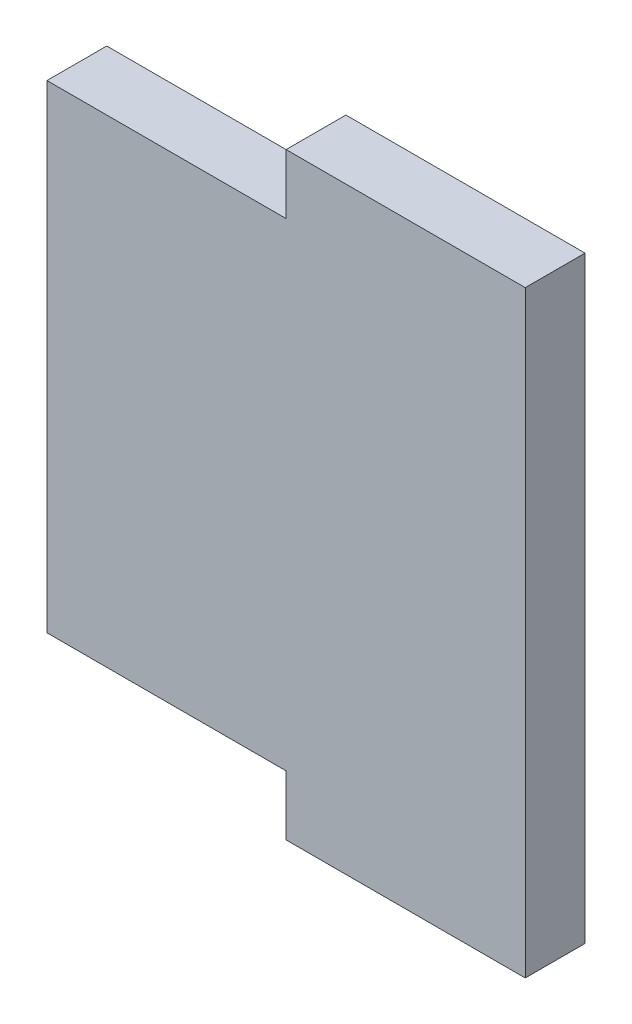
ISO-10303-21;
HEADER;
FILE_DESCRIPTION(('STEP AP214'),'2;1');
FILE_NAME('part.step','',(''),(''),'','','');
FILE_SCHEMA(('AUTOMOTIVE_DESIGN { 1 0 10303 214 1 1 1 1 }'));
ENDSEC;
DATA;
#1=APPLICATION_CONTEXT('core data for automotive mechanical design processes');
#2=APPLICATION_PROTOCOL_DEFINITION('international standard','automotive_design',2000,#1);
#3=PRODUCT_CONTEXT('',#1,'mechanical');
#4=PRODUCT('Part','Part','',(#3));
#5=PRODUCT_RELATED_PRODUCT_CATEGORY('part','',(#4));
#6=PRODUCT_DEFINITION_FORMATION('','',#4);
#7=PRODUCT_DEFINITION_CONTEXT('part definition',#1,'design');
#8=PRODUCT_DEFINITION('design','',#6,#7);
#9=PRODUCT_DEFINITION_SHAPE('','',#8);
#10=(LENGTH_UNIT() NAMED_UNIT(*) SI_UNIT(.MILLI.,.METRE.));
#11=(NAMED_UNIT(*) PLANE_ANGLE_UNIT() SI_UNIT($,.RADIAN.));
#12=(NAMED_UNIT(*) SI_UNIT($,.STERADIAN.) SOLID_ANGLE_UNIT());
#13=UNCERTAINTY_MEASURE_WITH_UNIT(LENGTH_MEASURE(1.E-05),#10,'distance_accuracy_value','');
#14=(GEOMETRIC_REPRESENTATION_CONTEXT(3) GLOBAL_UNCERTAINTY_ASSIGNED_CONTEXT((#13)) GLOBAL_UNIT_ASSIGNED_CONTEXT((#10,
#11,#12)) REPRESENTATION_CONTEXT('',''));
#15=CARTESIAN_POINT('',(0.,0.,0.));
#16=DIRECTION('',(0.,0.,1.));
#17=DIRECTION('',(1.,0.,0.));
#18=AXIS2_PLACEMENT_3D('',#15,#16,#17);
#19=CARTESIAN_POINT('',(212.725,0.,3.175));
#20=DIRECTION('',(0.,-1.,0.));
#21=DIRECTION('',(0.,0.,-1.));
#22=AXIS2_PLACEMENT_3D('',#19,#20,#21);
#23=PLANE('',#22);
#24=DIRECTION('',(-1.,0.,0.));
#25=VECTOR('',#24,1.);
#26=CARTESIAN_POINT('',(212.725,0.,0.));
#27=LINE('',#26,#25);
#28=CARTESIAN_POINT('',(212.725,0.,0.));
#29=VERTEX_POINT('',#28);
#30=CARTESIAN_POINT('',(200.025,0.,0.));
#31=VERTEX_POINT('',#30);
#32=EDGE_CURVE('E129',#29,#31,#27,.T.);
#33=ORIENTED_EDGE('',*,*,#32,.T.);
#34=DIRECTION('',(0.,0.,-1.));
#35=VECTOR('',#34,1.);
#36=CARTESIAN_POINT('',(200.025,0.,3.175));
#37=LINE('',#36,#35);
#38=CARTESIAN_POINT('',(200.025,0.,3.175));
#39=VERTEX_POINT('',#38);
#40=EDGE_CURVE('E11',#39,#31,#37,.T.);
#41=ORIENTED_EDGE('',*,*,#40,.F.);
#42=DIRECTION('',(-1.,0.,0.));
#43=VECTOR('',#42,1.);
#44=CARTESIAN_POINT('',(212.725,0.,3.175));
#45=LINE('',#44,#43);
#46=CARTESIAN_POINT('',(212.725,0.,3.175));
#47=VERTEX_POINT('',#46);
#48=EDGE_CURVE('E148',#47,#39,#45,.T.);
#49=ORIENTED_EDGE('',*,*,#48,.F.);
#50=DIRECTION('',(0.,0.,-1.));
#51=VECTOR('',#50,1.);
#52=CARTESIAN_POINT('',(212.725,0.,3.175));
#53=LINE('',#52,#51);
#54=EDGE_CURVE('E49',#47,#29,#53,.T.);
#55=ORIENTED_EDGE('',*,*,#54,.T.);
#56=EDGE_LOOP('',(#33,#41,#49,#55));
#57=FACE_BOUND('',#56,.T.);
#58=ADVANCED_FACE('F33',(#57),#23,.F.);
#59=CARTESIAN_POINT('',(200.025,0.,3.175));
#60=DIRECTION('',(1.,0.,0.));
#61=DIRECTION('',(0.,0.,-1.));
#62=AXIS2_PLACEMENT_3D('',#59,#60,#61);
#63=PLANE('',#62);
#64=DIRECTION('',(0.,-1.,0.));
#65=VECTOR('',#64,1.);
#66=CARTESIAN_POINT('',(200.025,0.,0.));
#67=LINE('',#66,#65);
#68=CARTESIAN_POINT('',(200.025,-3.175,0.));
#69=VERTEX_POINT('',#68);
#70=EDGE_CURVE('E131',#31,#69,#67,.T.);
#71=ORIENTED_EDGE('',*,*,#70,.T.);
#72=DIRECTION('',(0.,0.,-1.));
#73=VECTOR('',#72,1.);
#74=CARTESIAN_POINT('',(200.025,-3.175,3.175));
#75=LINE('',#74,#73);
#76=CARTESIAN_POINT('',(200.025,-3.175,3.175));
#77=VERTEX_POINT('',#76);
#78=EDGE_CURVE('E41',#77,#69,#75,.T.);
#79=ORIENTED_EDGE('',*,*,#78,.F.);
#80=DIRECTION('',(0.,-1.,0.));
#81=VECTOR('',#80,1.);
#82=CARTESIAN_POINT('',(200.025,0.,3.175));
#83=LINE('',#82,#81);
#84=EDGE_CURVE('E87',#39,#77,#83,.T.);
#85=ORIENTED_EDGE('',*,*,#84,.F.);
#86=ORIENTED_EDGE('',*,*,#40,.T.);
#87=EDGE_LOOP('',(#71,#79,#85,#86));
#88=FACE_BOUND('',#87,.T.);
#89=ADVANCED_FACE('F162',(#88),#63,.F.);
#90=CARTESIAN_POINT('',(187.325,-3.175,3.175));
#91=DIRECTION('',(0.,1.,0.));
#92=DIRECTION('',(0.,0.,1.));
#93=AXIS2_PLACEMENT_3D('',#90,#91,#92);
#94=PLANE('',#93);
#95=DIRECTION('',(1.,0.,0.));
#96=VECTOR('',#95,1.);
#97=CARTESIAN_POINT('',(187.325,-3.175,0.));
#98=LINE('',#97,#96);
#99=CARTESIAN_POINT('',(187.325,-3.175,0.));
#100=VERTEX_POINT('',#99);
#101=EDGE_CURVE('E134',#100,#69,#98,.T.);
#102=ORIENTED_EDGE('',*,*,#101,.F.);
#103=DIRECTION('',(0.,0.,-1.));
#104=VECTOR('',#103,1.);
#105=CARTESIAN_POINT('',(187.325,-3.175,3.175));
#106=LINE('',#105,#104);
#107=CARTESIAN_POINT('',(187.325,-3.175,3.175));
#108=VERTEX_POINT('',#107);
#109=EDGE_CURVE('E155',#108,#100,#106,.T.);
#110=ORIENTED_EDGE('',*,*,#109,.F.);
#111=DIRECTION('',(1.,0.,0.));
#112=VECTOR('',#111,1.);
#113=CARTESIAN_POINT('',(187.325,-3.175,3.175));
#114=LINE('',#113,#112);
#115=EDGE_CURVE('E161',#108,#77,#114,.T.);
#116=ORIENTED_EDGE('',*,*,#115,.T.);
#117=ORIENTED_EDGE('',*,*,#78,.T.);
#118=EDGE_LOOP('',(#102,#110,#116,#117));
#119=FACE_BOUND('',#118,.T.);
#120=ADVANCED_FACE('F159',(#119),#94,.T.);
#121=CARTESIAN_POINT('',(187.325,-3.175,3.175));
#122=DIRECTION('',(1.,0.,0.));
#123=DIRECTION('',(0.,0.,-1.));
#124=AXIS2_PLACEMENT_3D('',#121,#122,#123);
#125=PLANE('',#124);
#126=DIRECTION('',(0.,-1.,0.));
#127=VECTOR('',#126,1.);
#128=CARTESIAN_POINT('',(187.325,-3.175,0.));
#129=LINE('',#128,#127);
#130=CARTESIAN_POINT('',(187.325,-28.575,0.));
#131=VERTEX_POINT('',#130);
#132=EDGE_CURVE('E137',#100,#131,#129,.T.);
#133=ORIENTED_EDGE('',*,*,#132,.T.);
#134=DIRECTION('',(0.,0.,-1.));
#135=VECTOR('',#134,1.);
#136=CARTESIAN_POINT('',(187.325,-28.575,3.175));
#137=LINE('',#136,#135);
#138=CARTESIAN_POINT('',(187.325,-28.575,3.175));
#139=VERTEX_POINT('',#138);
#140=EDGE_CURVE('E152',#139,#131,#137,.T.);
#141=ORIENTED_EDGE('',*,*,#140,.F.);
#142=DIRECTION('',(0.,-1.,0.));
#143=VECTOR('',#142,1.);
#144=CARTESIAN_POINT('',(187.325,-3.175,3.175));
#145=LINE('',#144,#143);
#146=EDGE_CURVE('E174',#108,#139,#145,.T.);
#147=ORIENTED_EDGE('',*,*,#146,.F.);
#148=ORIENTED_EDGE('',*,*,#109,.T.);
#149=EDGE_LOOP('',(#133,#141,#147,#148));
#150=FACE_BOUND('',#149,.T.);
#151=ADVANCED_FACE('F170',(#150),#125,.F.);
#152=CARTESIAN_POINT('',(187.325,-28.575,3.175));
#153=DIRECTION('',(0.,1.,0.));
#154=DIRECTION('',(0.,0.,1.));
#155=AXIS2_PLACEMENT_3D('',#152,#153,#154);
#156=PLANE('',#155);
#157=DIRECTION('',(1.,0.,0.));
#158=VECTOR('',#157,1.);
#159=CARTESIAN_POINT('',(187.325,-28.575,0.));
#160=LINE('',#159,#158);
#161=CARTESIAN_POINT('',(200.025,-28.575,0.));
#162=VERTEX_POINT('',#161);
#163=EDGE_CURVE('E139',#131,#162,#160,.T.);
#164=ORIENTED_EDGE('',*,*,#163,.T.);
#165=DIRECTION('',(0.,0.,-1.));
#166=VECTOR('',#165,1.);
#167=CARTESIAN_POINT('',(200.025,-28.575,3.175));
#168=LINE('',#167,#166);
#169=CARTESIAN_POINT('',(200.025,-28.575,3.175));
#170=VERTEX_POINT('',#169);
#171=EDGE_CURVE('E112',#170,#162,#168,.T.);
#172=ORIENTED_EDGE('',*,*,#171,.F.);
#173=DIRECTION('',(1.,0.,0.));
#174=VECTOR('',#173,1.);
#175=CARTESIAN_POINT('',(187.325,-28.575,3.175));
#176=LINE('',#175,#174);
#177=EDGE_CURVE('E120',#139,#170,#176,.T.);
#178=ORIENTED_EDGE('',*,*,#177,.F.);
#179=ORIENTED_EDGE('',*,*,#140,.T.);
#180=EDGE_LOOP('',(#164,#172,#178,#179));
#181=FACE_BOUND('',#180,.T.);
#182=ADVANCED_FACE('F173',(#181),#156,.F.);
#183=CARTESIAN_POINT('',(200.025,-31.75,3.175));
#184=DIRECTION('',(-1.,0.,0.));
#185=DIRECTION('',(0.,0.,1.));
#186=AXIS2_PLACEMENT_3D('',#183,#184,#185);
#187=PLANE('',#186);
#188=DIRECTION('',(0.,1.,0.));
#189=VECTOR('',#188,1.);
#190=CARTESIAN_POINT('',(200.025,-31.75,0.));
#191=LINE('',#190,#189);
#192=CARTESIAN_POINT('',(200.025,-31.75,0.));
#193=VERTEX_POINT('',#192);
#194=EDGE_CURVE('E108',#193,#162,#191,.T.);
#195=ORIENTED_EDGE('',*,*,#194,.F.);
#196=DIRECTION('',(0.,0.,-1.));
#197=VECTOR('',#196,1.);
#198=CARTESIAN_POINT('',(200.025,-31.75,3.175));
#199=LINE('',#198,#197);
#200=CARTESIAN_POINT('',(200.025,-31.75,3.175));
#201=VERTEX_POINT('',#200);
#202=EDGE_CURVE('E103',#201,#193,#199,.T.);
#203=ORIENTED_EDGE('',*,*,#202,.F.);
#204=DIRECTION('',(0.,1.,0.));
#205=VECTOR('',#204,1.);
#206=CARTESIAN_POINT('',(200.025,-31.75,3.175));
#207=LINE('',#206,#205);
#208=EDGE_CURVE('E106',#201,#170,#207,.T.);
#209=ORIENTED_EDGE('',*,*,#208,.T.);
#210=ORIENTED_EDGE('',*,*,#171,.T.);
#211=EDGE_LOOP('',(#195,#203,#209,#210));
#212=FACE_BOUND('',#211,.T.);
#213=ADVANCED_FACE('F105',(#212),#187,.T.);
#214=CARTESIAN_POINT('',(212.725,-31.75,3.175));
#215=DIRECTION('',(0.,-1.,0.));
#216=DIRECTION('',(0.,0.,-1.));
#217=AXIS2_PLACEMENT_3D('',#214,#215,#216);
#218=PLANE('',#217);
#219=DIRECTION('',(-1.,0.,0.));
#220=VECTOR('',#219,1.);
#221=CARTESIAN_POINT('',(212.725,-31.75,0.));
#222=LINE('',#221,#220);
#223=CARTESIAN_POINT('',(212.725,-31.75,0.));
#224=VERTEX_POINT('',#223);
#225=EDGE_CURVE('E143',#224,#193,#222,.T.);
#226=ORIENTED_EDGE('',*,*,#225,.F.);
#227=DIRECTION('',(0.,0.,-1.));
#228=VECTOR('',#227,1.);
#229=CARTESIAN_POINT('',(212.725,-31.75,3.175));
#230=LINE('',#229,#228);
#231=CARTESIAN_POINT('',(212.725,-31.75,3.175));
#232=VERTEX_POINT('',#231);
#233=EDGE_CURVE('E75',#232,#224,#230,.T.);
#234=ORIENTED_EDGE('',*,*,#233,.F.);
#235=DIRECTION('',(-1.,0.,0.));
#236=VECTOR('',#235,1.);
#237=CARTESIAN_POINT('',(212.725,-31.75,3.175));
#238=LINE('',#237,#236);
#239=EDGE_CURVE('E118',#232,#201,#238,.T.);
#240=ORIENTED_EDGE('',*,*,#239,.T.);
#241=ORIENTED_EDGE('',*,*,#202,.T.);
#242=EDGE_LOOP('',(#226,#234,#240,#241));
#243=FACE_BOUND('',#242,.T.);
#244=ADVANCED_FACE('F123',(#243),#218,.T.);
#245=CARTESIAN_POINT('',(212.725,0.,3.175));
#246=DIRECTION('',(1.,0.,0.));
#247=DIRECTION('',(0.,0.,-1.));
#248=AXIS2_PLACEMENT_3D('',#245,#246,#247);
#249=PLANE('',#248);
#250=DIRECTION('',(0.,-1.,0.));
#251=VECTOR('',#250,1.);
#252=CARTESIAN_POINT('',(212.725,0.,0.));
#253=LINE('',#252,#251);
#254=EDGE_CURVE('E145',#29,#224,#253,.T.);
#255=ORIENTED_EDGE('',*,*,#254,.F.);
#256=ORIENTED_EDGE('',*,*,#54,.F.);
#257=DIRECTION('',(0.,-1.,0.));
#258=VECTOR('',#257,1.);
#259=CARTESIAN_POINT('',(212.725,0.,3.175));
#260=LINE('',#259,#258);
#261=EDGE_CURVE('E124',#47,#232,#260,.T.);
#262=ORIENTED_EDGE('',*,*,#261,.T.);
#263=ORIENTED_EDGE('',*,*,#233,.T.);
#264=EDGE_LOOP('',(#255,#256,#262,#263));
#265=FACE_BOUND('',#264,.T.);
#266=ADVANCED_FACE('F179',(#265),#249,.T.);
#267=CARTESIAN_POINT('',(0.,0.,3.175));
#268=DIRECTION('',(0.,0.,1.));
#269=DIRECTION('',(1.,0.,0.));
#270=AXIS2_PLACEMENT_3D('',#267,#268,#269);
#271=PLANE('',#270);
#272=ORIENTED_EDGE('',*,*,#48,.T.);
#273=ORIENTED_EDGE('',*,*,#84,.T.);
#274=ORIENTED_EDGE('',*,*,#115,.F.);
#275=ORIENTED_EDGE('',*,*,#146,.T.);
#276=ORIENTED_EDGE('',*,*,#177,.T.);
#277=ORIENTED_EDGE('',*,*,#208,.F.);
#278=ORIENTED_EDGE('',*,*,#239,.F.);
#279=ORIENTED_EDGE('',*,*,#261,.F.);
#280=EDGE_LOOP('',(#272,#273,#274,#275,#276,#277,#278,#279));
#281=FACE_BOUND('',#280,.T.);
#282=ADVANCED_FACE('F116',(#281),#271,.T.);
#283=CARTESIAN_POINT('',(0.,0.,0.));
#284=DIRECTION('',(0.,0.,1.));
#285=DIRECTION('',(1.,0.,0.));
#286=AXIS2_PLACEMENT_3D('',#283,#284,#285);
#287=PLANE('',#286);
#288=ORIENTED_EDGE('',*,*,#32,.F.);
#289=ORIENTED_EDGE('',*,*,#254,.T.);
#290=ORIENTED_EDGE('',*,*,#225,.T.);
#291=ORIENTED_EDGE('',*,*,#194,.T.);
#292=ORIENTED_EDGE('',*,*,#163,.F.);
#293=ORIENTED_EDGE('',*,*,#132,.F.);
#294=ORIENTED_EDGE('',*,*,#101,.T.);
#295=ORIENTED_EDGE('',*,*,#70,.F.);
#296=EDGE_LOOP('',(#288,#289,#290,#291,#292,#293,#294,#295));
#297=FACE_BOUND('',#296,.T.);
#298=ADVANCED_FACE('F166',(#297),#287,.F.);
#299=CLOSED_SHELL('',(#58,#89,#120,#151,#182,#213,#244,#266,#282,#298));
#300=MANIFOLD_SOLID_BREP('B2',#299);
#301=ADVANCED_BREP_SHAPE_REPRESENTATION('',(#18,#300),#14);
#302=SHAPE_DEFINITION_REPRESENTATION(#9,#301);
ENDSEC;
END-ISO-10303-21;
